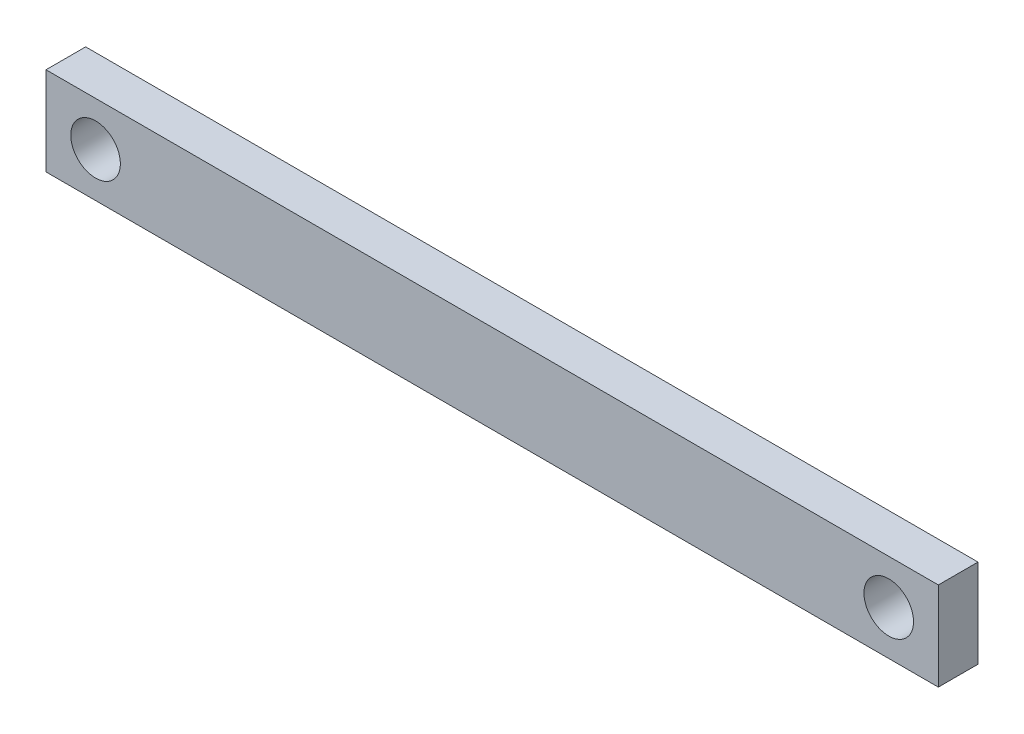
ISO-10303-21;
HEADER;
FILE_DESCRIPTION(('STEP AP214'),'2;1');
FILE_NAME('part.step','',(''),(''),'','','');
FILE_SCHEMA(('AUTOMOTIVE_DESIGN { 1 0 10303 214 1 1 1 1 }'));
ENDSEC;
DATA;
#1=APPLICATION_CONTEXT('core data for automotive mechanical design processes');
#2=APPLICATION_PROTOCOL_DEFINITION('international standard','automotive_design',2000,#1);
#3=PRODUCT_CONTEXT('',#1,'mechanical');
#4=PRODUCT('Part','Part','',(#3));
#5=PRODUCT_RELATED_PRODUCT_CATEGORY('part','',(#4));
#6=PRODUCT_DEFINITION_FORMATION('','',#4);
#7=PRODUCT_DEFINITION_CONTEXT('part definition',#1,'design');
#8=PRODUCT_DEFINITION('design','',#6,#7);
#9=PRODUCT_DEFINITION_SHAPE('','',#8);
#10=(LENGTH_UNIT() NAMED_UNIT(*) SI_UNIT(.MILLI.,.METRE.));
#11=(NAMED_UNIT(*) PLANE_ANGLE_UNIT() SI_UNIT($,.RADIAN.));
#12=(NAMED_UNIT(*) SI_UNIT($,.STERADIAN.) SOLID_ANGLE_UNIT());
#13=UNCERTAINTY_MEASURE_WITH_UNIT(LENGTH_MEASURE(1.E-05),#10,'distance_accuracy_value','');
#14=(GEOMETRIC_REPRESENTATION_CONTEXT(3) GLOBAL_UNCERTAINTY_ASSIGNED_CONTEXT((#13)) GLOBAL_UNIT_ASSIGNED_CONTEXT((#10,
#11,#12)) REPRESENTATION_CONTEXT('',''));
#15=CARTESIAN_POINT('',(0.,0.,0.));
#16=DIRECTION('',(0.,0.,1.));
#17=DIRECTION('',(1.,0.,0.));
#18=AXIS2_PLACEMENT_3D('',#15,#16,#17);
#19=CARTESIAN_POINT('',(0.,0.,4.));
#20=DIRECTION('',(0.,0.,-1.));
#21=DIRECTION('',(-1.,0.,0.));
#22=AXIS2_PLACEMENT_3D('',#19,#20,#21);
#23=PLANE('',#22);
#24=DIRECTION('',(0.,1.,0.));
#25=VECTOR('',#24,1.);
#26=CARTESIAN_POINT('',(45.0000000000001,-4.46311475409837,4.));
#27=LINE('',#26,#25);
#28=CARTESIAN_POINT('',(45.0000000000001,-4.46311475409837,4.));
#29=VERTEX_POINT('',#28);
#30=CARTESIAN_POINT('',(45.0000000000001,4.46311475409837,4.));
#31=VERTEX_POINT('',#30);
#32=EDGE_CURVE('E85',#29,#31,#27,.T.);
#33=ORIENTED_EDGE('',*,*,#32,.T.);
#34=DIRECTION('',(-1.,0.,0.));
#35=VECTOR('',#34,1.);
#36=CARTESIAN_POINT('',(-44.9999999999999,4.46311475409835,4.));
#37=LINE('',#36,#35);
#38=CARTESIAN_POINT('',(-44.9999999999999,4.46311475409835,4.));
#39=VERTEX_POINT('',#38);
#40=EDGE_CURVE('E80',#31,#39,#37,.T.);
#41=ORIENTED_EDGE('',*,*,#40,.T.);
#42=DIRECTION('',(0.,-1.,0.));
#43=VECTOR('',#42,1.);
#44=CARTESIAN_POINT('',(-44.9999999999999,-4.46311475409837,4.));
#45=LINE('',#44,#43);
#46=CARTESIAN_POINT('',(-44.9999999999999,-4.46311475409837,4.));
#47=VERTEX_POINT('',#46);
#48=EDGE_CURVE('E83',#39,#47,#45,.T.);
#49=ORIENTED_EDGE('',*,*,#48,.T.);
#50=DIRECTION('',(1.,0.,0.));
#51=VECTOR('',#50,1.);
#52=CARTESIAN_POINT('',(-44.9999999999999,-4.46311475409837,4.));
#53=LINE('',#52,#51);
#54=EDGE_CURVE('E50',#47,#29,#53,.T.);
#55=ORIENTED_EDGE('',*,*,#54,.T.);
#56=EDGE_LOOP('',(#33,#41,#49,#55));
#57=FACE_BOUND('',#56,.T.);
#58=CARTESIAN_POINT('',(-40.,0.,4.));
#59=DIRECTION('',(0.,0.,1.));
#60=DIRECTION('',(1.,0.,0.));
#61=AXIS2_PLACEMENT_3D('',#58,#59,#60);
#62=CIRCLE('',#61,2.5);
#63=CARTESIAN_POINT('',(-37.5,0.,4.));
#64=VERTEX_POINT('',#63);
#65=EDGE_CURVE('E100',#64,#64,#62,.T.);
#66=ORIENTED_EDGE('',*,*,#65,.F.);
#67=EDGE_LOOP('',(#66));
#68=FACE_BOUND('',#67,.T.);
#69=CARTESIAN_POINT('',(40.,0.,4.));
#70=DIRECTION('',(0.,0.,1.));
#71=DIRECTION('',(-1.,0.,0.));
#72=AXIS2_PLACEMENT_3D('',#69,#70,#71);
#73=CIRCLE('',#72,2.5);
#74=CARTESIAN_POINT('',(37.5,0.,4.));
#75=VERTEX_POINT('',#74);
#76=EDGE_CURVE('E115',#75,#75,#73,.T.);
#77=ORIENTED_EDGE('',*,*,#76,.F.);
#78=EDGE_LOOP('',(#77));
#79=FACE_BOUND('',#78,.T.);
#80=ADVANCED_FACE('F33',(#57,#68,#79),#23,.F.);
#81=CARTESIAN_POINT('',(0.,0.,0.));
#82=DIRECTION('',(0.,0.,-1.));
#83=DIRECTION('',(-1.,0.,0.));
#84=AXIS2_PLACEMENT_3D('',#81,#82,#83);
#85=PLANE('',#84);
#86=CARTESIAN_POINT('',(-40.,0.,0.));
#87=DIRECTION('',(0.,0.,1.));
#88=DIRECTION('',(1.,0.,0.));
#89=AXIS2_PLACEMENT_3D('',#86,#87,#88);
#90=CIRCLE('',#89,2.5);
#91=CARTESIAN_POINT('',(-37.5,0.,0.));
#92=VERTEX_POINT('',#91);
#93=EDGE_CURVE('E112',#92,#92,#90,.T.);
#94=ORIENTED_EDGE('',*,*,#93,.T.);
#95=EDGE_LOOP('',(#94));
#96=FACE_BOUND('',#95,.T.);
#97=DIRECTION('',(0.,1.,0.));
#98=VECTOR('',#97,1.);
#99=CARTESIAN_POINT('',(45.0000000000001,-4.46311475409837,0.));
#100=LINE('',#99,#98);
#101=CARTESIAN_POINT('',(45.0000000000001,-4.46311475409837,0.));
#102=VERTEX_POINT('',#101);
#103=CARTESIAN_POINT('',(45.0000000000001,4.46311475409837,0.));
#104=VERTEX_POINT('',#103);
#105=EDGE_CURVE('E97',#102,#104,#100,.T.);
#106=ORIENTED_EDGE('',*,*,#105,.F.);
#107=DIRECTION('',(1.,0.,0.));
#108=VECTOR('',#107,1.);
#109=CARTESIAN_POINT('',(-44.9999999999999,-4.46311475409837,0.));
#110=LINE('',#109,#108);
#111=CARTESIAN_POINT('',(-44.9999999999999,-4.46311475409837,0.));
#112=VERTEX_POINT('',#111);
#113=EDGE_CURVE('E73',#112,#102,#110,.T.);
#114=ORIENTED_EDGE('',*,*,#113,.F.);
#115=DIRECTION('',(0.,-1.,0.));
#116=VECTOR('',#115,1.);
#117=CARTESIAN_POINT('',(-44.9999999999999,-4.46311475409837,0.));
#118=LINE('',#117,#116);
#119=CARTESIAN_POINT('',(-44.9999999999999,4.46311475409835,0.));
#120=VERTEX_POINT('',#119);
#121=EDGE_CURVE('E67',#120,#112,#118,.T.);
#122=ORIENTED_EDGE('',*,*,#121,.F.);
#123=DIRECTION('',(-1.,0.,0.));
#124=VECTOR('',#123,1.);
#125=CARTESIAN_POINT('',(-44.9999999999999,4.46311475409835,0.));
#126=LINE('',#125,#124);
#127=EDGE_CURVE('E89',#104,#120,#126,.T.);
#128=ORIENTED_EDGE('',*,*,#127,.F.);
#129=EDGE_LOOP('',(#106,#114,#122,#128));
#130=FACE_BOUND('',#129,.T.);
#131=CARTESIAN_POINT('',(40.,0.,0.));
#132=DIRECTION('',(0.,0.,1.));
#133=DIRECTION('',(-1.,0.,0.));
#134=AXIS2_PLACEMENT_3D('',#131,#132,#133);
#135=CIRCLE('',#134,2.5);
#136=CARTESIAN_POINT('',(37.5,0.,0.));
#137=VERTEX_POINT('',#136);
#138=EDGE_CURVE('E118',#137,#137,#135,.T.);
#139=ORIENTED_EDGE('',*,*,#138,.T.);
#140=EDGE_LOOP('',(#139));
#141=FACE_BOUND('',#140,.T.);
#142=ADVANCED_FACE('F108',(#96,#130,#141),#85,.T.);
#143=CARTESIAN_POINT('',(45.0000000000001,-4.46311475409837,4.));
#144=DIRECTION('',(-1.,0.,0.));
#145=DIRECTION('',(0.,0.,1.));
#146=AXIS2_PLACEMENT_3D('',#143,#144,#145);
#147=PLANE('',#146);
#148=ORIENTED_EDGE('',*,*,#105,.T.);
#149=DIRECTION('',(0.,0.,-1.));
#150=VECTOR('',#149,1.);
#151=CARTESIAN_POINT('',(45.0000000000001,4.46311475409837,4.));
#152=LINE('',#151,#150);
#153=EDGE_CURVE('E11',#31,#104,#152,.T.);
#154=ORIENTED_EDGE('',*,*,#153,.F.);
#155=ORIENTED_EDGE('',*,*,#32,.F.);
#156=DIRECTION('',(0.,0.,-1.));
#157=VECTOR('',#156,1.);
#158=CARTESIAN_POINT('',(45.0000000000001,-4.46311475409837,4.));
#159=LINE('',#158,#157);
#160=EDGE_CURVE('E93',#29,#102,#159,.T.);
#161=ORIENTED_EDGE('',*,*,#160,.T.);
#162=EDGE_LOOP('',(#148,#154,#155,#161));
#163=FACE_BOUND('',#162,.T.);
#164=ADVANCED_FACE('F35',(#163),#147,.F.);
#165=CARTESIAN_POINT('',(-44.9999999999999,4.46311475409835,4.));
#166=DIRECTION('',(0.,-1.,0.));
#167=DIRECTION('',(1.,0.,0.));
#168=AXIS2_PLACEMENT_3D('',#165,#166,#167);
#169=PLANE('',#168);
#170=ORIENTED_EDGE('',*,*,#127,.T.);
#171=DIRECTION('',(0.,0.,-1.));
#172=VECTOR('',#171,1.);
#173=CARTESIAN_POINT('',(-44.9999999999999,4.46311475409835,4.));
#174=LINE('',#173,#172);
#175=EDGE_CURVE('E42',#39,#120,#174,.T.);
#176=ORIENTED_EDGE('',*,*,#175,.F.);
#177=ORIENTED_EDGE('',*,*,#40,.F.);
#178=ORIENTED_EDGE('',*,*,#153,.T.);
#179=EDGE_LOOP('',(#170,#176,#177,#178));
#180=FACE_BOUND('',#179,.T.);
#181=ADVANCED_FACE('F88',(#180),#169,.F.);
#182=CARTESIAN_POINT('',(-44.9999999999999,-4.46311475409837,4.));
#183=DIRECTION('',(1.,0.,0.));
#184=DIRECTION('',(0.,0.,-1.));
#185=AXIS2_PLACEMENT_3D('',#182,#183,#184);
#186=PLANE('',#185);
#187=ORIENTED_EDGE('',*,*,#121,.T.);
#188=DIRECTION('',(0.,0.,-1.));
#189=VECTOR('',#188,1.);
#190=CARTESIAN_POINT('',(-44.9999999999999,-4.46311475409837,4.));
#191=LINE('',#190,#189);
#192=EDGE_CURVE('E90',#47,#112,#191,.T.);
#193=ORIENTED_EDGE('',*,*,#192,.F.);
#194=ORIENTED_EDGE('',*,*,#48,.F.);
#195=ORIENTED_EDGE('',*,*,#175,.T.);
#196=EDGE_LOOP('',(#187,#193,#194,#195));
#197=FACE_BOUND('',#196,.T.);
#198=ADVANCED_FACE('F91',(#197),#186,.F.);
#199=CARTESIAN_POINT('',(-44.9999999999999,-4.46311475409837,4.));
#200=DIRECTION('',(0.,1.,0.));
#201=DIRECTION('',(0.,0.,1.));
#202=AXIS2_PLACEMENT_3D('',#199,#200,#201);
#203=PLANE('',#202);
#204=ORIENTED_EDGE('',*,*,#113,.T.);
#205=ORIENTED_EDGE('',*,*,#160,.F.);
#206=ORIENTED_EDGE('',*,*,#54,.F.);
#207=ORIENTED_EDGE('',*,*,#192,.T.);
#208=EDGE_LOOP('',(#204,#205,#206,#207));
#209=FACE_BOUND('',#208,.T.);
#210=ADVANCED_FACE('F105',(#209),#203,.F.);
#211=CARTESIAN_POINT('',(-40.,0.,4.));
#212=DIRECTION('',(0.,0.,-1.));
#213=DIRECTION('',(-1.,0.,0.));
#214=AXIS2_PLACEMENT_3D('',#211,#212,#213);
#215=CYLINDRICAL_SURFACE('',#214,2.5);
#216=ORIENTED_EDGE('',*,*,#65,.T.);
#217=EDGE_LOOP('',(#216));
#218=FACE_BOUND('',#217,.T.);
#219=ORIENTED_EDGE('',*,*,#93,.F.);
#220=EDGE_LOOP('',(#219));
#221=FACE_BOUND('',#220,.T.);
#222=ADVANCED_FACE('F135',(#218,#221),#215,.F.);
#223=CARTESIAN_POINT('',(40.,0.,4.));
#224=DIRECTION('',(0.,0.,-1.));
#225=DIRECTION('',(-1.,0.,0.));
#226=AXIS2_PLACEMENT_3D('',#223,#224,#225);
#227=CYLINDRICAL_SURFACE('',#226,2.5);
#228=ORIENTED_EDGE('',*,*,#76,.T.);
#229=EDGE_LOOP('',(#228));
#230=FACE_BOUND('',#229,.T.);
#231=ORIENTED_EDGE('',*,*,#138,.F.);
#232=EDGE_LOOP('',(#231));
#233=FACE_BOUND('',#232,.T.);
#234=ADVANCED_FACE('F124',(#230,#233),#227,.F.);
#235=CLOSED_SHELL('',(#80,#142,#164,#181,#198,#210,#222,#234));
#236=MANIFOLD_SOLID_BREP('B2',#235);
#237=ADVANCED_BREP_SHAPE_REPRESENTATION('',(#18,#236),#14);
#238=SHAPE_DEFINITION_REPRESENTATION(#9,#237);
ENDSEC;
END-ISO-10303-21;
